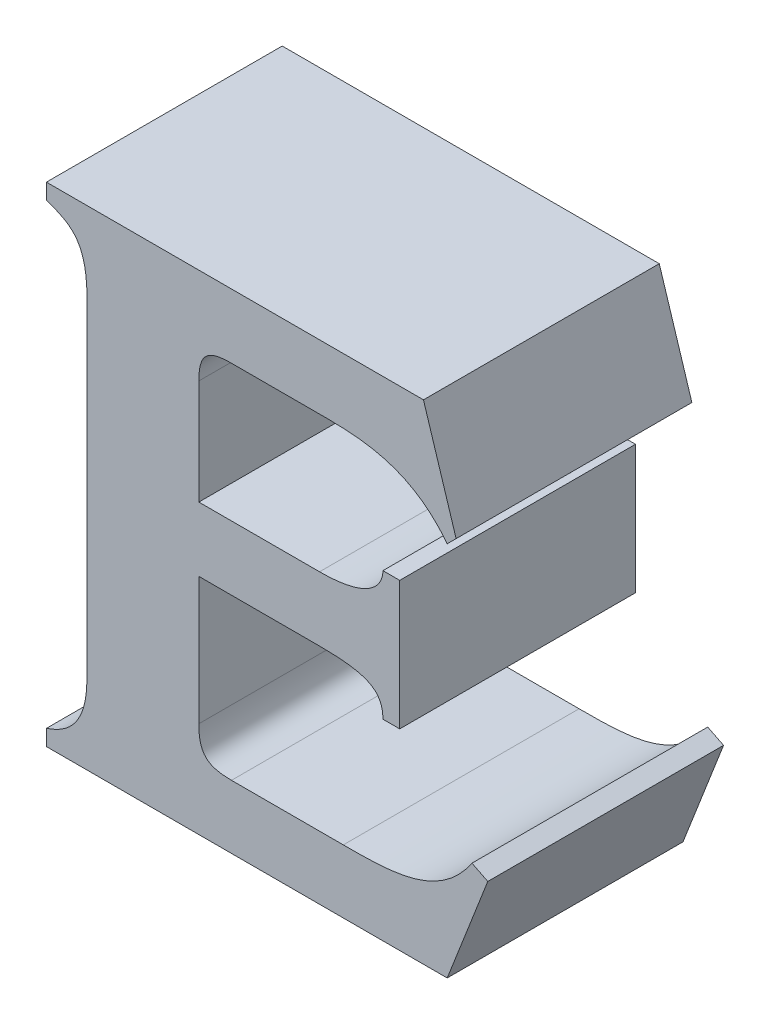
ISO-10303-21;
HEADER;
FILE_DESCRIPTION(('STEP AP214'),'2;1');
FILE_NAME('part.step','',(''),(''),'','','');
FILE_SCHEMA(('AUTOMOTIVE_DESIGN { 1 0 10303 214 1 1 1 1 }'));
ENDSEC;
DATA;
#1=APPLICATION_CONTEXT('core data for automotive mechanical design processes');
#2=APPLICATION_PROTOCOL_DEFINITION('international standard','automotive_design',2000,#1);
#3=PRODUCT_CONTEXT('',#1,'mechanical');
#4=PRODUCT('Part','Part','',(#3));
#5=PRODUCT_RELATED_PRODUCT_CATEGORY('part','',(#4));
#6=PRODUCT_DEFINITION_FORMATION('','',#4);
#7=PRODUCT_DEFINITION_CONTEXT('part definition',#1,'design');
#8=PRODUCT_DEFINITION('design','',#6,#7);
#9=PRODUCT_DEFINITION_SHAPE('','',#8);
#10=(LENGTH_UNIT() NAMED_UNIT(*) SI_UNIT(.MILLI.,.METRE.));
#11=(NAMED_UNIT(*) PLANE_ANGLE_UNIT() SI_UNIT($,.RADIAN.));
#12=(NAMED_UNIT(*) SI_UNIT($,.STERADIAN.) SOLID_ANGLE_UNIT());
#13=UNCERTAINTY_MEASURE_WITH_UNIT(LENGTH_MEASURE(1.E-05),#10,'distance_accuracy_value','');
#14=(GEOMETRIC_REPRESENTATION_CONTEXT(3) GLOBAL_UNCERTAINTY_ASSIGNED_CONTEXT((#13)) GLOBAL_UNIT_ASSIGNED_CONTEXT((#10,
#11,#12)) REPRESENTATION_CONTEXT('',''));
#15=CARTESIAN_POINT('',(0.,0.,0.));
#16=DIRECTION('',(0.,0.,1.));
#17=DIRECTION('',(1.,0.,0.));
#18=AXIS2_PLACEMENT_3D('',#15,#16,#17);
#19=CARTESIAN_POINT('',(2.257040111163,-0.25995003071244,0.));
#20=CARTESIAN_POINT('',(2.257040111163,-0.25995003071244,0.1));
#21=CARTESIAN_POINT('',(2.267113803681,-0.26330769945751,0.));
#22=CARTESIAN_POINT('',(2.267113803681,-0.26330769945751,0.1));
#23=CARTESIAN_POINT('',(2.274249270892,-0.26666549298124,0.));
#24=CARTESIAN_POINT('',(2.274249270892,-0.26666549298124,0.1));
#25=CARTESIAN_POINT('',(2.274249270892,-0.28723157278345,0.));
#26=CARTESIAN_POINT('',(2.274249270892,-0.28723157278345,0.1));
#27=B_SPLINE_SURFACE_WITH_KNOTS('',3,1,((#19,#20),(#21,#22),(#23,#24),(#25,#26)),.UNSPECIFIED.,
.F.,.F.,.F.,(4,4),(2,2),(-1.,0.),(0.,0.01),.UNSPECIFIED.);
#28=CARTESIAN_POINT('',(2.274249270892,-0.28723157278345,0.));
#29=CARTESIAN_POINT('',(2.274249270892,-0.26666549298124,0.));
#30=CARTESIAN_POINT('',(2.267113803681,-0.26330769945751,0.));
#31=CARTESIAN_POINT('',(2.257040111163,-0.25995003071244,0.));
#32=B_SPLINE_CURVE_WITH_KNOTS('',3,(#28,#29,#30,#31),.UNSPECIFIED.,.F.,.F.,(4,4),(0.,1.),.UNSPECIFIED.);
#33=CARTESIAN_POINT('',(2.274249270892,-0.28723157278345,0.));
#34=VERTEX_POINT('',#33);
#35=CARTESIAN_POINT('',(2.257040111163,-0.25995003071244,0.));
#36=VERTEX_POINT('',#35);
#37=EDGE_CURVE('E11',#34,#36,#32,.T.);
#38=DIRECTION('',(0.,0.,1.));
#39=VECTOR('',#38,1.);
#40=CARTESIAN_POINT('',(2.274249270892,-0.28723157278345,0.));
#41=LINE('',#40,#39);
#42=CARTESIAN_POINT('',(2.274249270892,-0.28723157278345,0.1));
#43=VERTEX_POINT('',#42);
#44=EDGE_CURVE('E28',#34,#43,#41,.T.);
#45=CARTESIAN_POINT('',(2.257040111163,-0.25995003071244,0.1));
#46=CARTESIAN_POINT('',(2.267113803681,-0.26330769945751,0.1));
#47=CARTESIAN_POINT('',(2.274249270892,-0.26666549298124,0.1));
#48=CARTESIAN_POINT('',(2.274249270892,-0.28723157278345,0.1));
#49=B_SPLINE_CURVE_WITH_KNOTS('',3,(#45,#46,#47,#48),.UNSPECIFIED.,.F.,.F.,(4,4),(-1.,0.),.UNSPECIFIED.);
#50=CARTESIAN_POINT('',(2.257040111163,-0.25995003071244,0.1));
#51=VERTEX_POINT('',#50);
#52=EDGE_CURVE('E212',#51,#43,#49,.T.);
#53=DIRECTION('',(0.,0.,1.));
#54=VECTOR('',#53,1.);
#55=CARTESIAN_POINT('',(2.257040111163,-0.25995003071244,0.));
#56=LINE('',#55,#54);
#57=EDGE_CURVE('E467',#36,#51,#56,.T.);
#58=ORIENTED_EDGE('',*,*,#37,.F.);
#59=ORIENTED_EDGE('',*,*,#44,.T.);
#60=ORIENTED_EDGE('',*,*,#52,.F.);
#61=ORIENTED_EDGE('',*,*,#57,.F.);
#62=EDGE_LOOP('',(#58,#59,#60,#61));
#63=FACE_BOUND('',#62,.T.);
#64=ADVANCED_FACE('F17',(#63),#27,.T.);
#65=CARTESIAN_POINT('',(2.257040111163,-0.25323453724898,0.));
#66=DIRECTION('',(-1.,0.,0.));
#67=DIRECTION('',(0.,-1.,0.));
#68=AXIS2_PLACEMENT_3D('',#65,#66,#67);
#69=PLANE('',#68);
#70=DIRECTION('',(0.,1.,0.));
#71=VECTOR('',#70,1.);
#72=CARTESIAN_POINT('',(2.257040111163,-0.25995003071244,0.));
#73=LINE('',#72,#71);
#74=CARTESIAN_POINT('',(2.257040111163,-0.25323453724898,0.));
#75=VERTEX_POINT('',#74);
#76=EDGE_CURVE('E465',#36,#75,#73,.T.);
#77=ORIENTED_EDGE('',*,*,#76,.F.);
#78=ORIENTED_EDGE('',*,*,#57,.T.);
#79=DIRECTION('',(0.,-1.,0.));
#80=VECTOR('',#79,1.);
#81=CARTESIAN_POINT('',(2.257040111163,-0.25995003071244,0.1));
#82=LINE('',#81,#80);
#83=CARTESIAN_POINT('',(2.257040111163,-0.25323453724898,0.1));
#84=VERTEX_POINT('',#83);
#85=EDGE_CURVE('E463',#84,#51,#82,.T.);
#86=ORIENTED_EDGE('',*,*,#85,.F.);
#87=DIRECTION('',(0.,0.,1.));
#88=VECTOR('',#87,1.);
#89=CARTESIAN_POINT('',(2.257040111163,-0.25323453724898,0.));
#90=LINE('',#89,#88);
#91=EDGE_CURVE('E460',#75,#84,#90,.T.);
#92=ORIENTED_EDGE('',*,*,#91,.F.);
#93=EDGE_LOOP('',(#77,#78,#86,#92));
#94=FACE_BOUND('',#93,.T.);
#95=ADVANCED_FACE('F566',(#94),#69,.T.);
#96=CARTESIAN_POINT('',(2.416952376184,-0.25323453724898,0.));
#97=DIRECTION('',(0.,1.,0.));
#98=DIRECTION('',(-1.,0.,0.));
#99=AXIS2_PLACEMENT_3D('',#96,#97,#98);
#100=PLANE('',#99);
#101=DIRECTION('',(1.,0.,0.));
#102=VECTOR('',#101,1.);
#103=CARTESIAN_POINT('',(2.257040111163,-0.25323453724898,0.));
#104=LINE('',#103,#102);
#105=CARTESIAN_POINT('',(2.416952376184,-0.25323453724898,0.));
#106=VERTEX_POINT('',#105);
#107=EDGE_CURVE('E458',#75,#106,#104,.T.);
#108=ORIENTED_EDGE('',*,*,#107,.F.);
#109=ORIENTED_EDGE('',*,*,#91,.T.);
#110=DIRECTION('',(-1.,0.,0.));
#111=VECTOR('',#110,1.);
#112=CARTESIAN_POINT('',(2.257040111163,-0.25323453724898,0.1));
#113=LINE('',#112,#111);
#114=CARTESIAN_POINT('',(2.416952376184,-0.25323453724898,0.1));
#115=VERTEX_POINT('',#114);
#116=EDGE_CURVE('E455',#115,#84,#113,.T.);
#117=ORIENTED_EDGE('',*,*,#116,.F.);
#118=DIRECTION('',(0.,0.,1.));
#119=VECTOR('',#118,1.);
#120=CARTESIAN_POINT('',(2.416952376184,-0.25323453724898,0.));
#121=LINE('',#120,#119);
#122=EDGE_CURVE('E452',#106,#115,#121,.T.);
#123=ORIENTED_EDGE('',*,*,#122,.F.);
#124=EDGE_LOOP('',(#108,#109,#117,#123));
#125=FACE_BOUND('',#124,.T.);
#126=ADVANCED_FACE('F562',(#125),#100,.T.);
#127=CARTESIAN_POINT('',(2.430803118496,-0.29730473499199,0.));
#128=DIRECTION('',(0.953993043631218,0.299828738954831,0.));
#129=DIRECTION('',(-0.299828738954831,0.953993043631218,0.));
#130=AXIS2_PLACEMENT_3D('',#127,#128,#129);
#131=PLANE('',#130);
#132=DIRECTION('',(0.299828738954831,-0.953993043631218,0.));
#133=VECTOR('',#132,1.);
#134=CARTESIAN_POINT('',(2.416952376184,-0.25323453724898,0.));
#135=LINE('',#134,#133);
#136=CARTESIAN_POINT('',(2.430803118496,-0.29730473499199,0.));
#137=VERTEX_POINT('',#136);
#138=EDGE_CURVE('E450',#106,#137,#135,.T.);
#139=ORIENTED_EDGE('',*,*,#138,.F.);
#140=ORIENTED_EDGE('',*,*,#122,.T.);
#141=DIRECTION('',(-0.299828738954831,0.953993043631218,0.));
#142=VECTOR('',#141,1.);
#143=CARTESIAN_POINT('',(2.416952376184,-0.25323453724898,0.1));
#144=LINE('',#143,#142);
#145=CARTESIAN_POINT('',(2.430803118496,-0.29730473499199,0.1));
#146=VERTEX_POINT('',#145);
#147=EDGE_CURVE('E447',#146,#115,#144,.T.);
#148=ORIENTED_EDGE('',*,*,#147,.F.);
#149=DIRECTION('',(0.,0.,1.));
#150=VECTOR('',#149,1.);
#151=CARTESIAN_POINT('',(2.430803118496,-0.29730473499199,0.));
#152=LINE('',#151,#150);
#153=EDGE_CURVE('E444',#137,#146,#152,.T.);
#154=ORIENTED_EDGE('',*,*,#153,.F.);
#155=EDGE_LOOP('',(#139,#140,#148,#154));
#156=FACE_BOUND('',#155,.T.);
#157=ADVANCED_FACE('F558',(#156),#131,.T.);
#158=CARTESIAN_POINT('',(2.427026068702,-0.301082252706,0.));
#159=DIRECTION('',(0.707150577097307,-0.707062982563043,0.));
#160=DIRECTION('',(0.707062982563043,0.707150577097307,0.));
#161=AXIS2_PLACEMENT_3D('',#158,#159,#160);
#162=PLANE('',#161);
#163=DIRECTION('',(-0.707062982563043,-0.707150577097307,0.));
#164=VECTOR('',#163,1.);
#165=CARTESIAN_POINT('',(2.430803118496,-0.29730473499199,0.));
#166=LINE('',#165,#164);
#167=CARTESIAN_POINT('',(2.427026068702,-0.301082252706,0.));
#168=VERTEX_POINT('',#167);
#169=EDGE_CURVE('E442',#137,#168,#166,.T.);
#170=ORIENTED_EDGE('',*,*,#169,.F.);
#171=ORIENTED_EDGE('',*,*,#153,.T.);
#172=DIRECTION('',(0.707062982563043,0.707150577097307,0.));
#173=VECTOR('',#172,1.);
#174=CARTESIAN_POINT('',(2.430803118496,-0.29730473499199,0.1));
#175=LINE('',#174,#173);
#176=CARTESIAN_POINT('',(2.427026068702,-0.301082252706,0.1));
#177=VERTEX_POINT('',#176);
#178=EDGE_CURVE('E439',#177,#146,#175,.T.);
#179=ORIENTED_EDGE('',*,*,#178,.F.);
#180=DIRECTION('',(0.,0.,1.));
#181=VECTOR('',#180,1.);
#182=CARTESIAN_POINT('',(2.427026068702,-0.301082252706,0.));
#183=LINE('',#182,#181);
#184=EDGE_CURVE('E433',#168,#177,#183,.T.);
#185=ORIENTED_EDGE('',*,*,#184,.F.);
#186=EDGE_LOOP('',(#170,#171,#179,#185));
#187=FACE_BOUND('',#186,.T.);
#188=ADVANCED_FACE('F554',(#187),#162,.T.);
#189=CARTESIAN_POINT('',(2.376240221522,-0.28051607931998,0.));
#190=CARTESIAN_POINT('',(2.376240221522,-0.28051607931998,0.1));
#191=CARTESIAN_POINT('',(2.396386046825,-0.28051607931998,0.));
#192=CARTESIAN_POINT('',(2.396386046825,-0.28051607931998,0.1));
#193=CARTESIAN_POINT('',(2.413595206554,-0.28387387284371,0.));
#194=CARTESIAN_POINT('',(2.413595206554,-0.28387387284371,0.1));
#195=CARTESIAN_POINT('',(2.427026068702,-0.301082252706,0.));
#196=CARTESIAN_POINT('',(2.427026068702,-0.301082252706,0.1));
#197=B_SPLINE_SURFACE_WITH_KNOTS('',3,1,((#189,#190),(#191,#192),(#193,#194),(#195,#196)),
.UNSPECIFIED.,.F.,.F.,.F.,(4,4),(2,2),(-1.,0.),(0.,0.01),.UNSPECIFIED.);
#198=CARTESIAN_POINT('',(2.427026068702,-0.301082252706,0.));
#199=CARTESIAN_POINT('',(2.413595206554,-0.28387387284371,0.));
#200=CARTESIAN_POINT('',(2.396386046825,-0.28051607931998,0.));
#201=CARTESIAN_POINT('',(2.376240221522,-0.28051607931998,0.));
#202=B_SPLINE_CURVE_WITH_KNOTS('',3,(#198,#199,#200,#201),.UNSPECIFIED.,.F.,.F.,(4,4),(0.,1.),.UNSPECIFIED.);
#203=CARTESIAN_POINT('',(2.376240221522,-0.28051607931998,0.));
#204=VERTEX_POINT('',#203);
#205=EDGE_CURVE('E426',#168,#204,#202,.T.);
#206=CARTESIAN_POINT('',(2.376240221522,-0.28051607931998,0.1));
#207=CARTESIAN_POINT('',(2.396386046825,-0.28051607931998,0.1));
#208=CARTESIAN_POINT('',(2.413595206554,-0.28387387284371,0.1));
#209=CARTESIAN_POINT('',(2.427026068702,-0.301082252706,0.1));
#210=B_SPLINE_CURVE_WITH_KNOTS('',3,(#206,#207,#208,#209),.UNSPECIFIED.,.F.,.F.,(4,4),(-1.,0.),.UNSPECIFIED.);
#211=CARTESIAN_POINT('',(2.376240221522,-0.28051607931998,0.1));
#212=VERTEX_POINT('',#211);
#213=EDGE_CURVE('E421',#212,#177,#210,.T.);
#214=DIRECTION('',(0.,0.,1.));
#215=VECTOR('',#214,1.);
#216=CARTESIAN_POINT('',(2.376240221522,-0.28051607931998,0.));
#217=LINE('',#216,#215);
#218=EDGE_CURVE('E418',#204,#212,#217,.T.);
#219=ORIENTED_EDGE('',*,*,#205,.F.);
#220=ORIENTED_EDGE('',*,*,#184,.T.);
#221=ORIENTED_EDGE('',*,*,#213,.F.);
#222=ORIENTED_EDGE('',*,*,#218,.F.);
#223=EDGE_LOOP('',(#219,#220,#221,#222));
#224=FACE_BOUND('',#223,.T.);
#225=ADVANCED_FACE('F550',(#224),#197,.T.);
#226=CARTESIAN_POINT('',(2.335527754914,-0.28051607931998,0.));
#227=DIRECTION('',(0.,-1.,0.));
#228=DIRECTION('',(1.,0.,0.));
#229=AXIS2_PLACEMENT_3D('',#226,#227,#228);
#230=PLANE('',#229);
#231=DIRECTION('',(-1.,0.,0.));
#232=VECTOR('',#231,1.);
#233=CARTESIAN_POINT('',(2.376240221522,-0.28051607931998,0.));
#234=LINE('',#233,#232);
#235=CARTESIAN_POINT('',(2.335527754914,-0.28051607931998,0.));
#236=VERTEX_POINT('',#235);
#237=EDGE_CURVE('E416',#204,#236,#234,.T.);
#238=ORIENTED_EDGE('',*,*,#237,.F.);
#239=ORIENTED_EDGE('',*,*,#218,.T.);
#240=DIRECTION('',(1.,0.,0.));
#241=VECTOR('',#240,1.);
#242=CARTESIAN_POINT('',(2.376240221522,-0.28051607931998,0.1));
#243=LINE('',#242,#241);
#244=CARTESIAN_POINT('',(2.335527754914,-0.28051607931998,0.1));
#245=VERTEX_POINT('',#244);
#246=EDGE_CURVE('E413',#245,#212,#243,.T.);
#247=ORIENTED_EDGE('',*,*,#246,.F.);
#248=DIRECTION('',(0.,0.,1.));
#249=VECTOR('',#248,1.);
#250=CARTESIAN_POINT('',(2.335527754914,-0.28051607931998,0.));
#251=LINE('',#250,#249);
#252=EDGE_CURVE('E407',#236,#245,#251,.T.);
#253=ORIENTED_EDGE('',*,*,#252,.F.);
#254=EDGE_LOOP('',(#238,#239,#247,#253));
#255=FACE_BOUND('',#254,.T.);
#256=ADVANCED_FACE('F546',(#255),#230,.T.);
#257=CARTESIAN_POINT('',(2.321677012602,-0.29394706624691,0.));
#258=CARTESIAN_POINT('',(2.321677012602,-0.29394706624691,0.1));
#259=CARTESIAN_POINT('',(2.321677012602,-0.283873872843711,0.));
#260=CARTESIAN_POINT('',(2.321677012602,-0.283873872843711,0.1));
#261=CARTESIAN_POINT('',(2.325035430019,-0.280516079319981,0.));
#262=CARTESIAN_POINT('',(2.325035430019,-0.280516079319981,0.1));
#263=CARTESIAN_POINT('',(2.335527754914,-0.28051607931998,0.));
#264=CARTESIAN_POINT('',(2.335527754914,-0.28051607931998,0.1));
#265=B_SPLINE_SURFACE_WITH_KNOTS('',3,1,((#257,#258),(#259,#260),(#261,#262),(#263,#264)),
.UNSPECIFIED.,.F.,.F.,.F.,(4,4),(2,2),(-1.,0.),(0.,0.01),.UNSPECIFIED.);
#266=CARTESIAN_POINT('',(2.335527754914,-0.28051607931998,0.));
#267=CARTESIAN_POINT('',(2.325035430019,-0.280516079319981,0.));
#268=CARTESIAN_POINT('',(2.321677012602,-0.283873872843711,0.));
#269=CARTESIAN_POINT('',(2.321677012602,-0.29394706624691,0.));
#270=B_SPLINE_CURVE_WITH_KNOTS('',3,(#266,#267,#268,#269),.UNSPECIFIED.,.F.,.F.,(4,4),(0.,1.),.UNSPECIFIED.);
#271=CARTESIAN_POINT('',(2.321677012602,-0.29394706624691,0.));
#272=VERTEX_POINT('',#271);
#273=EDGE_CURVE('E400',#236,#272,#270,.T.);
#274=CARTESIAN_POINT('',(2.321677012602,-0.29394706624691,0.1));
#275=CARTESIAN_POINT('',(2.321677012602,-0.283873872843711,0.1));
#276=CARTESIAN_POINT('',(2.325035430019,-0.280516079319981,0.1));
#277=CARTESIAN_POINT('',(2.335527754914,-0.28051607931998,0.1));
#278=B_SPLINE_CURVE_WITH_KNOTS('',3,(#274,#275,#276,#277),.UNSPECIFIED.,.F.,.F.,(4,4),(-1.,0.),.UNSPECIFIED.);
#279=CARTESIAN_POINT('',(2.321677012602,-0.29394706624691,0.1));
#280=VERTEX_POINT('',#279);
#281=EDGE_CURVE('E395',#280,#245,#278,.T.);
#282=DIRECTION('',(0.,0.,1.));
#283=VECTOR('',#282,1.);
#284=CARTESIAN_POINT('',(2.321677012602,-0.29394706624691,0.));
#285=LINE('',#284,#283);
#286=EDGE_CURVE('E392',#272,#280,#285,.T.);
#287=ORIENTED_EDGE('',*,*,#273,.F.);
#288=ORIENTED_EDGE('',*,*,#252,.T.);
#289=ORIENTED_EDGE('',*,*,#281,.F.);
#290=ORIENTED_EDGE('',*,*,#286,.F.);
#291=EDGE_LOOP('',(#287,#288,#289,#290));
#292=FACE_BOUND('',#291,.T.);
#293=ADVANCED_FACE('F542',(#292),#265,.T.);
#294=CARTESIAN_POINT('',(2.321677012602,-0.33843698818,0.));
#295=DIRECTION('',(1.,0.,0.));
#296=DIRECTION('',(0.,1.,0.));
#297=AXIS2_PLACEMENT_3D('',#294,#295,#296);
#298=PLANE('',#297);
#299=DIRECTION('',(0.,-1.,0.));
#300=VECTOR('',#299,1.);
#301=CARTESIAN_POINT('',(2.321677012602,-0.29394706624691,0.));
#302=LINE('',#301,#300);
#303=CARTESIAN_POINT('',(2.321677012602,-0.33843698818,0.));
#304=VERTEX_POINT('',#303);
#305=EDGE_CURVE('E390',#272,#304,#302,.T.);
#306=ORIENTED_EDGE('',*,*,#305,.F.);
#307=ORIENTED_EDGE('',*,*,#286,.T.);
#308=DIRECTION('',(0.,1.,0.));
#309=VECTOR('',#308,1.);
#310=CARTESIAN_POINT('',(2.321677012602,-0.29394706624691,0.1));
#311=LINE('',#310,#309);
#312=CARTESIAN_POINT('',(2.321677012602,-0.33843698818,0.1));
#313=VERTEX_POINT('',#312);
#314=EDGE_CURVE('E387',#313,#280,#311,.T.);
#315=ORIENTED_EDGE('',*,*,#314,.F.);
#316=DIRECTION('',(0.,0.,1.));
#317=VECTOR('',#316,1.);
#318=CARTESIAN_POINT('',(2.321677012602,-0.33843698818,0.));
#319=LINE('',#318,#317);
#320=EDGE_CURVE('E384',#304,#313,#319,.T.);
#321=ORIENTED_EDGE('',*,*,#320,.F.);
#322=EDGE_LOOP('',(#306,#307,#315,#321));
#323=FACE_BOUND('',#322,.T.);
#324=ADVANCED_FACE('F538',(#323),#298,.T.);
#325=CARTESIAN_POINT('',(2.372883051892,-0.33843698818,0.));
#326=DIRECTION('',(0.,1.,0.));
#327=DIRECTION('',(-1.,0.,0.));
#328=AXIS2_PLACEMENT_3D('',#325,#326,#327);
#329=PLANE('',#328);
#330=DIRECTION('',(1.,0.,0.));
#331=VECTOR('',#330,1.);
#332=CARTESIAN_POINT('',(2.321677012602,-0.33843698818,0.));
#333=LINE('',#332,#331);
#334=CARTESIAN_POINT('',(2.372883051892,-0.33843698818,0.));
#335=VERTEX_POINT('',#334);
#336=EDGE_CURVE('E382',#304,#335,#333,.T.);
#337=ORIENTED_EDGE('',*,*,#336,.F.);
#338=ORIENTED_EDGE('',*,*,#320,.T.);
#339=DIRECTION('',(-1.,0.,0.));
#340=VECTOR('',#339,1.);
#341=CARTESIAN_POINT('',(2.321677012602,-0.33843698818,0.1));
#342=LINE('',#341,#340);
#343=CARTESIAN_POINT('',(2.372883051892,-0.33843698818,0.1));
#344=VERTEX_POINT('',#343);
#345=EDGE_CURVE('E379',#344,#313,#342,.T.);
#346=ORIENTED_EDGE('',*,*,#345,.F.);
#347=DIRECTION('',(0.,0.,1.));
#348=VECTOR('',#347,1.);
#349=CARTESIAN_POINT('',(2.372883051892,-0.33843698818,0.));
#350=LINE('',#349,#348);
#351=EDGE_CURVE('E373',#335,#344,#350,.T.);
#352=ORIENTED_EDGE('',*,*,#351,.F.);
#353=EDGE_LOOP('',(#337,#338,#346,#352));
#354=FACE_BOUND('',#353,.T.);
#355=ADVANCED_FACE('F534',(#354),#329,.T.);
#356=CARTESIAN_POINT('',(2.399744464242,-0.324586401842,0.));
#357=CARTESIAN_POINT('',(2.399744464242,-0.324586401842,0.1));
#358=CARTESIAN_POINT('',(2.399744464242,-0.325739771816933,0.));
#359=CARTESIAN_POINT('',(2.399744464242,-0.325739771816933,0.1));
#360=CARTESIAN_POINT('',(2.399546374781,-0.326872743783356,0.));
#361=CARTESIAN_POINT('',(2.399546374781,-0.326872743783356,0.1));
#362=CARTESIAN_POINT('',(2.398714006222,-0.329144178592833,0.));
#363=CARTESIAN_POINT('',(2.398714006222,-0.329144178592833,0.1));
#364=CARTESIAN_POINT('',(2.398059521087,-0.330221366822531,0.));
#365=CARTESIAN_POINT('',(2.398059521087,-0.330221366822531,0.1));
#366=CARTESIAN_POINT('',(2.395942997548,-0.332703011870604,0.));
#367=CARTESIAN_POINT('',(2.395942997548,-0.332703011870604,0.1));
#368=CARTESIAN_POINT('',(2.394280510628,-0.333886760831212,0.));
#369=CARTESIAN_POINT('',(2.394280510628,-0.333886760831212,0.1));
#370=CARTESIAN_POINT('',(2.390032531593,-0.336084495495303,0.));
#371=CARTESIAN_POINT('',(2.390032531593,-0.336084495495303,0.1));
#372=CARTESIAN_POINT('',(2.387230743201,-0.336909730052862,0.));
#373=CARTESIAN_POINT('',(2.387230743201,-0.336909730052862,0.1));
#374=CARTESIAN_POINT('',(2.380734122965,-0.33817836475508,0.));
#375=CARTESIAN_POINT('',(2.380734122965,-0.33817836475508,0.1));
#376=CARTESIAN_POINT('',(2.376718552933,-0.33843698818,0.));
#377=CARTESIAN_POINT('',(2.376718552933,-0.33843698818,0.1));
#378=CARTESIAN_POINT('',(2.372883051892,-0.33843698818,0.));
#379=CARTESIAN_POINT('',(2.372883051892,-0.33843698818,0.1));
#380=B_SPLINE_SURFACE_WITH_KNOTS('',3,1,((#356,#357),(#358,#359),(#360,#361),(#362,#363),(#364,
#365),(#366,#367),(#368,#369),(#370,#371),(#372,#373),(#374,#375),(#376,#377),(#378,#379)),
.UNSPECIFIED.,.F.,.F.,.F.,(4,2,2,2,2,4),(2,2),(-0.003320004529042,-0.002971228597344,
-0.002589112087022,-0.001987326490876,-0.001150650312329,0.),(0.,0.01),.UNSPECIFIED.);
#381=CARTESIAN_POINT('',(2.372883051892,-0.33843698818,0.));
#382=CARTESIAN_POINT('',(2.376718552933,-0.33843698818,0.));
#383=CARTESIAN_POINT('',(2.380734122965,-0.33817836475508,0.));
#384=CARTESIAN_POINT('',(2.387230743201,-0.336909730052862,0.));
#385=CARTESIAN_POINT('',(2.390032531593,-0.336084495495303,0.));
#386=CARTESIAN_POINT('',(2.394280510628,-0.333886760831212,0.));
#387=CARTESIAN_POINT('',(2.395942997548,-0.332703011870604,0.));
#388=CARTESIAN_POINT('',(2.398059521087,-0.330221366822531,0.));
#389=CARTESIAN_POINT('',(2.398714006222,-0.329144178592833,0.));
#390=CARTESIAN_POINT('',(2.399546374781,-0.326872743783356,0.));
#391=CARTESIAN_POINT('',(2.399744464242,-0.325739771816933,0.));
#392=CARTESIAN_POINT('',(2.399744464242,-0.324586401842,0.));
#393=B_SPLINE_CURVE_WITH_KNOTS('',3,(#381,#382,#383,#384,#385,#386,#387,#388,#389,#390,#391,
#392),.UNSPECIFIED.,.F.,.F.,(4,2,2,2,2,4),(0.,0.001150650312329,0.001987326490876,
0.002589112087022,0.002971228597344,0.003320004529042),.UNSPECIFIED.);
#394=CARTESIAN_POINT('',(2.399744464242,-0.324586401842,0.));
#395=VERTEX_POINT('',#394);
#396=EDGE_CURVE('E366',#335,#395,#393,.T.);
#397=CARTESIAN_POINT('',(2.399744464242,-0.324586401842,0.1));
#398=CARTESIAN_POINT('',(2.399744464242,-0.325739771816933,0.1));
#399=CARTESIAN_POINT('',(2.399546374781,-0.326872743783356,0.1));
#400=CARTESIAN_POINT('',(2.398714006222,-0.329144178592833,0.1));
#401=CARTESIAN_POINT('',(2.398059521087,-0.330221366822531,0.1));
#402=CARTESIAN_POINT('',(2.395942997548,-0.332703011870604,0.1));
#403=CARTESIAN_POINT('',(2.394280510628,-0.333886760831212,0.1));
#404=CARTESIAN_POINT('',(2.390032531593,-0.336084495495303,0.1));
#405=CARTESIAN_POINT('',(2.387230743201,-0.336909730052862,0.1));
#406=CARTESIAN_POINT('',(2.380734122965,-0.33817836475508,0.1));
#407=CARTESIAN_POINT('',(2.376718552933,-0.33843698818,0.1));
#408=CARTESIAN_POINT('',(2.372883051892,-0.33843698818,0.1));
#409=B_SPLINE_CURVE_WITH_KNOTS('',3,(#397,#398,#399,#400,#401,#402,#403,#404,#405,#406,#407,
#408),.UNSPECIFIED.,.F.,.F.,(4,2,2,2,2,4),(-0.003320004529042,-0.002971228597344,
-0.002589112087022,-0.001987326490876,-0.001150650312329,0.),.UNSPECIFIED.);
#410=CARTESIAN_POINT('',(2.399744464242,-0.324586401842,0.1));
#411=VERTEX_POINT('',#410);
#412=EDGE_CURVE('E361',#411,#344,#409,.T.);
#413=DIRECTION('',(0.,0.,1.));
#414=VECTOR('',#413,1.);
#415=CARTESIAN_POINT('',(2.399744464242,-0.324586401842,0.));
#416=LINE('',#415,#414);
#417=EDGE_CURVE('E358',#395,#411,#416,.T.);
#418=ORIENTED_EDGE('',*,*,#396,.F.);
#419=ORIENTED_EDGE('',*,*,#351,.T.);
#420=ORIENTED_EDGE('',*,*,#412,.F.);
#421=ORIENTED_EDGE('',*,*,#417,.F.);
#422=EDGE_LOOP('',(#418,#419,#420,#421));
#423=FACE_BOUND('',#422,.T.);
#424=ADVANCED_FACE('F530',(#423),#380,.T.);
#425=CARTESIAN_POINT('',(2.406879931453,-0.324586401842,0.));
#426=DIRECTION('',(0.,1.,0.));
#427=DIRECTION('',(-1.,0.,0.));
#428=AXIS2_PLACEMENT_3D('',#425,#426,#427);
#429=PLANE('',#428);
#430=DIRECTION('',(1.,0.,0.));
#431=VECTOR('',#430,1.);
#432=CARTESIAN_POINT('',(2.399744464242,-0.324586401842,0.));
#433=LINE('',#432,#431);
#434=CARTESIAN_POINT('',(2.406879931453,-0.324586401842,0.));
#435=VERTEX_POINT('',#434);
#436=EDGE_CURVE('E356',#395,#435,#433,.T.);
#437=ORIENTED_EDGE('',*,*,#436,.F.);
#438=ORIENTED_EDGE('',*,*,#417,.T.);
#439=DIRECTION('',(-1.,0.,0.));
#440=VECTOR('',#439,1.);
#441=CARTESIAN_POINT('',(2.399744464242,-0.324586401842,0.1));
#442=LINE('',#441,#440);
#443=CARTESIAN_POINT('',(2.406879931453,-0.324586401842,0.1));
#444=VERTEX_POINT('',#443);
#445=EDGE_CURVE('E353',#444,#411,#442,.T.);
#446=ORIENTED_EDGE('',*,*,#445,.F.);
#447=DIRECTION('',(0.,0.,1.));
#448=VECTOR('',#447,1.);
#449=CARTESIAN_POINT('',(2.406879931453,-0.324586401842,0.));
#450=LINE('',#449,#448);
#451=EDGE_CURVE('E350',#435,#444,#450,.T.);
#452=ORIENTED_EDGE('',*,*,#451,.F.);
#453=EDGE_LOOP('',(#437,#438,#446,#452));
#454=FACE_BOUND('',#453,.T.);
#455=ADVANCED_FACE('F526',(#454),#429,.T.);
#456=CARTESIAN_POINT('',(2.406879931453,-0.379149485984,0.));
#457=DIRECTION('',(1.,0.,0.));
#458=DIRECTION('',(0.,1.,0.));
#459=AXIS2_PLACEMENT_3D('',#456,#457,#458);
#460=PLANE('',#459);
#461=DIRECTION('',(0.,-1.,0.));
#462=VECTOR('',#461,1.);
#463=CARTESIAN_POINT('',(2.406879931453,-0.324586401842,0.));
#464=LINE('',#463,#462);
#465=CARTESIAN_POINT('',(2.406879931453,-0.379149485984,0.));
#466=VERTEX_POINT('',#465);
#467=EDGE_CURVE('E348',#435,#466,#464,.T.);
#468=ORIENTED_EDGE('',*,*,#467,.F.);
#469=ORIENTED_EDGE('',*,*,#451,.T.);
#470=DIRECTION('',(0.,1.,0.));
#471=VECTOR('',#470,1.);
#472=CARTESIAN_POINT('',(2.406879931453,-0.324586401842,0.1));
#473=LINE('',#472,#471);
#474=CARTESIAN_POINT('',(2.406879931453,-0.379149485984,0.1));
#475=VERTEX_POINT('',#474);
#476=EDGE_CURVE('E345',#475,#444,#473,.T.);
#477=ORIENTED_EDGE('',*,*,#476,.F.);
#478=DIRECTION('',(0.,0.,1.));
#479=VECTOR('',#478,1.);
#480=CARTESIAN_POINT('',(2.406879931453,-0.379149485984,0.));
#481=LINE('',#480,#479);
#482=EDGE_CURVE('E342',#466,#475,#481,.T.);
#483=ORIENTED_EDGE('',*,*,#482,.F.);
#484=EDGE_LOOP('',(#468,#469,#477,#483));
#485=FACE_BOUND('',#484,.T.);
#486=ADVANCED_FACE('F522',(#485),#460,.T.);
#487=CARTESIAN_POINT('',(2.399744464242,-0.379149485984,0.));
#488=DIRECTION('',(0.,-1.,0.));
#489=DIRECTION('',(1.,0.,0.));
#490=AXIS2_PLACEMENT_3D('',#487,#488,#489);
#491=PLANE('',#490);
#492=DIRECTION('',(-1.,0.,0.));
#493=VECTOR('',#492,1.);
#494=CARTESIAN_POINT('',(2.406879931453,-0.379149485984,0.));
#495=LINE('',#494,#493);
#496=CARTESIAN_POINT('',(2.399744464242,-0.379149485984,0.));
#497=VERTEX_POINT('',#496);
#498=EDGE_CURVE('E340',#466,#497,#495,.T.);
#499=ORIENTED_EDGE('',*,*,#498,.F.);
#500=ORIENTED_EDGE('',*,*,#482,.T.);
#501=DIRECTION('',(1.,0.,0.));
#502=VECTOR('',#501,1.);
#503=CARTESIAN_POINT('',(2.406879931453,-0.379149485984,0.1));
#504=LINE('',#503,#502);
#505=CARTESIAN_POINT('',(2.399744464242,-0.379149485984,0.1));
#506=VERTEX_POINT('',#505);
#507=EDGE_CURVE('E337',#506,#475,#504,.T.);
#508=ORIENTED_EDGE('',*,*,#507,.F.);
#509=DIRECTION('',(0.,0.,1.));
#510=VECTOR('',#509,1.);
#511=CARTESIAN_POINT('',(2.399744464242,-0.379149485984,0.));
#512=LINE('',#511,#510);
#513=EDGE_CURVE('E331',#497,#506,#512,.T.);
#514=ORIENTED_EDGE('',*,*,#513,.F.);
#515=EDGE_LOOP('',(#499,#500,#508,#514));
#516=FACE_BOUND('',#515,.T.);
#517=ADVANCED_FACE('F518',(#516),#491,.T.);
#518=CARTESIAN_POINT('',(2.372883051892,-0.365718530251,0.));
#519=CARTESIAN_POINT('',(2.372883051892,-0.365718530251,0.1));
#520=CARTESIAN_POINT('',(2.393029189141,-0.365718530250999,0.));
#521=CARTESIAN_POINT('',(2.393029189141,-0.365718530250999,0.1));
#522=CARTESIAN_POINT('',(2.399744464242,-0.369076323774999,0.));
#523=CARTESIAN_POINT('',(2.399744464242,-0.369076323774999,0.1));
#524=CARTESIAN_POINT('',(2.399744464242,-0.379149485984,0.));
#525=CARTESIAN_POINT('',(2.399744464242,-0.379149485984,0.1));
#526=B_SPLINE_SURFACE_WITH_KNOTS('',3,1,((#518,#519),(#520,#521),(#522,#523),(#524,#525)),
.UNSPECIFIED.,.F.,.F.,.F.,(4,4),(2,2),(-1.,0.),(0.,0.01),.UNSPECIFIED.);
#527=CARTESIAN_POINT('',(2.399744464242,-0.379149485984,0.));
#528=CARTESIAN_POINT('',(2.399744464242,-0.369076323774999,0.));
#529=CARTESIAN_POINT('',(2.393029189141,-0.365718530250999,0.));
#530=CARTESIAN_POINT('',(2.372883051892,-0.365718530251,0.));
#531=B_SPLINE_CURVE_WITH_KNOTS('',3,(#527,#528,#529,#530),.UNSPECIFIED.,.F.,.F.,(4,4),(0.,1.),.UNSPECIFIED.);
#532=CARTESIAN_POINT('',(2.372883051892,-0.365718530251,0.));
#533=VERTEX_POINT('',#532);
#534=EDGE_CURVE('E324',#497,#533,#531,.T.);
#535=CARTESIAN_POINT('',(2.372883051892,-0.365718530251,0.1));
#536=CARTESIAN_POINT('',(2.393029189141,-0.365718530250999,0.1));
#537=CARTESIAN_POINT('',(2.399744464242,-0.369076323774999,0.1));
#538=CARTESIAN_POINT('',(2.399744464242,-0.379149485984,0.1));
#539=B_SPLINE_CURVE_WITH_KNOTS('',3,(#535,#536,#537,#538),.UNSPECIFIED.,.F.,.F.,(4,4),(-1.,0.),.UNSPECIFIED.);
#540=CARTESIAN_POINT('',(2.372883051892,-0.365718530251,0.1));
#541=VERTEX_POINT('',#540);
#542=EDGE_CURVE('E319',#541,#506,#539,.T.);
#543=DIRECTION('',(0.,0.,1.));
#544=VECTOR('',#543,1.);
#545=CARTESIAN_POINT('',(2.372883051892,-0.365718530251,0.));
#546=LINE('',#545,#544);
#547=EDGE_CURVE('E316',#533,#541,#546,.T.);
#548=ORIENTED_EDGE('',*,*,#534,.F.);
#549=ORIENTED_EDGE('',*,*,#513,.T.);
#550=ORIENTED_EDGE('',*,*,#542,.F.);
#551=ORIENTED_EDGE('',*,*,#547,.F.);
#552=EDGE_LOOP('',(#548,#549,#550,#551));
#553=FACE_BOUND('',#552,.T.);
#554=ADVANCED_FACE('F514',(#553),#526,.T.);
#555=CARTESIAN_POINT('',(2.321677012602,-0.365718530251,0.));
#556=DIRECTION('',(0.,-1.,0.));
#557=DIRECTION('',(1.,0.,0.));
#558=AXIS2_PLACEMENT_3D('',#555,#556,#557);
#559=PLANE('',#558);
#560=DIRECTION('',(-1.,0.,0.));
#561=VECTOR('',#560,1.);
#562=CARTESIAN_POINT('',(2.372883051892,-0.365718530251,0.));
#563=LINE('',#562,#561);
#564=CARTESIAN_POINT('',(2.321677012602,-0.365718530251,0.));
#565=VERTEX_POINT('',#564);
#566=EDGE_CURVE('E314',#533,#565,#563,.T.);
#567=ORIENTED_EDGE('',*,*,#566,.F.);
#568=ORIENTED_EDGE('',*,*,#547,.T.);
#569=DIRECTION('',(1.,0.,0.));
#570=VECTOR('',#569,1.);
#571=CARTESIAN_POINT('',(2.372883051892,-0.365718530251,0.1));
#572=LINE('',#571,#570);
#573=CARTESIAN_POINT('',(2.321677012602,-0.365718530251,0.1));
#574=VERTEX_POINT('',#573);
#575=EDGE_CURVE('E311',#574,#541,#572,.T.);
#576=ORIENTED_EDGE('',*,*,#575,.F.);
#577=DIRECTION('',(0.,0.,1.));
#578=VECTOR('',#577,1.);
#579=CARTESIAN_POINT('',(2.321677012602,-0.365718530251,0.));
#580=LINE('',#579,#578);
#581=EDGE_CURVE('E308',#565,#574,#580,.T.);
#582=ORIENTED_EDGE('',*,*,#581,.F.);
#583=EDGE_LOOP('',(#567,#568,#576,#582));
#584=FACE_BOUND('',#583,.T.);
#585=ADVANCED_FACE('F510',(#584),#559,.T.);
#586=CARTESIAN_POINT('',(2.321677012602,-0.419862014982,0.));
#587=DIRECTION('',(1.,0.,0.));
#588=DIRECTION('',(0.,1.,0.));
#589=AXIS2_PLACEMENT_3D('',#586,#587,#588);
#590=PLANE('',#589);
#591=DIRECTION('',(0.,-1.,0.));
#592=VECTOR('',#591,1.);
#593=CARTESIAN_POINT('',(2.321677012602,-0.365718530251,0.));
#594=LINE('',#593,#592);
#595=CARTESIAN_POINT('',(2.321677012602,-0.419862014982,0.));
#596=VERTEX_POINT('',#595);
#597=EDGE_CURVE('E306',#565,#596,#594,.T.);
#598=ORIENTED_EDGE('',*,*,#597,.F.);
#599=ORIENTED_EDGE('',*,*,#581,.T.);
#600=DIRECTION('',(0.,1.,0.));
#601=VECTOR('',#600,1.);
#602=CARTESIAN_POINT('',(2.321677012602,-0.365718530251,0.1));
#603=LINE('',#602,#601);
#604=CARTESIAN_POINT('',(2.321677012602,-0.419862014982,0.1));
#605=VERTEX_POINT('',#604);
#606=EDGE_CURVE('E303',#605,#574,#603,.T.);
#607=ORIENTED_EDGE('',*,*,#606,.F.);
#608=DIRECTION('',(0.,0.,1.));
#609=VECTOR('',#608,1.);
#610=CARTESIAN_POINT('',(2.321677012602,-0.419862014982,0.));
#611=LINE('',#610,#609);
#612=EDGE_CURVE('E297',#596,#605,#611,.T.);
#613=ORIENTED_EDGE('',*,*,#612,.F.);
#614=EDGE_LOOP('',(#598,#599,#607,#613));
#615=FACE_BOUND('',#614,.T.);
#616=ADVANCED_FACE('F506',(#615),#590,.T.);
#617=CARTESIAN_POINT('',(2.335527754914,-0.43371260132,0.));
#618=CARTESIAN_POINT('',(2.335527754914,-0.43371260132,0.1));
#619=CARTESIAN_POINT('',(2.325035430019,-0.43371260132,0.));
#620=CARTESIAN_POINT('',(2.325035430019,-0.43371260132,0.1));
#621=CARTESIAN_POINT('',(2.321677012602,-0.430354901381,0.));
#622=CARTESIAN_POINT('',(2.321677012602,-0.430354901381,0.1));
#623=CARTESIAN_POINT('',(2.321677012602,-0.419862014982,0.));
#624=CARTESIAN_POINT('',(2.321677012602,-0.419862014982,0.1));
#625=B_SPLINE_SURFACE_WITH_KNOTS('',3,1,((#617,#618),(#619,#620),(#621,#622),(#623,#624)),
.UNSPECIFIED.,.F.,.F.,.F.,(4,4),(2,2),(-1.,0.),(0.,0.01),.UNSPECIFIED.);
#626=CARTESIAN_POINT('',(2.321677012602,-0.419862014982,0.));
#627=CARTESIAN_POINT('',(2.321677012602,-0.430354901381,0.));
#628=CARTESIAN_POINT('',(2.325035430019,-0.43371260132,0.));
#629=CARTESIAN_POINT('',(2.335527754914,-0.43371260132,0.));
#630=B_SPLINE_CURVE_WITH_KNOTS('',3,(#626,#627,#628,#629),.UNSPECIFIED.,.F.,.F.,(4,4),(0.,1.),.UNSPECIFIED.);
#631=CARTESIAN_POINT('',(2.335527754914,-0.43371260132,0.));
#632=VERTEX_POINT('',#631);
#633=EDGE_CURVE('E290',#596,#632,#630,.T.);
#634=CARTESIAN_POINT('',(2.335527754914,-0.43371260132,0.1));
#635=CARTESIAN_POINT('',(2.325035430019,-0.43371260132,0.1));
#636=CARTESIAN_POINT('',(2.321677012602,-0.430354901381,0.1));
#637=CARTESIAN_POINT('',(2.321677012602,-0.419862014982,0.1));
#638=B_SPLINE_CURVE_WITH_KNOTS('',3,(#634,#635,#636,#637),.UNSPECIFIED.,.F.,.F.,(4,4),(-1.,0.),.UNSPECIFIED.);
#639=CARTESIAN_POINT('',(2.335527754914,-0.43371260132,0.1));
#640=VERTEX_POINT('',#639);
#641=EDGE_CURVE('E285',#640,#605,#638,.T.);
#642=DIRECTION('',(0.,0.,1.));
#643=VECTOR('',#642,1.);
#644=CARTESIAN_POINT('',(2.335527754914,-0.43371260132,0.));
#645=LINE('',#644,#643);
#646=EDGE_CURVE('E282',#632,#640,#645,.T.);
#647=ORIENTED_EDGE('',*,*,#633,.F.);
#648=ORIENTED_EDGE('',*,*,#612,.T.);
#649=ORIENTED_EDGE('',*,*,#641,.F.);
#650=ORIENTED_EDGE('',*,*,#646,.F.);
#651=EDGE_LOOP('',(#647,#648,#649,#650));
#652=FACE_BOUND('',#651,.T.);
#653=ADVANCED_FACE('F502',(#652),#625,.T.);
#654=CARTESIAN_POINT('',(2.382955496623,-0.43371260132,0.));
#655=DIRECTION('',(0.,1.,0.));
#656=DIRECTION('',(-1.,0.,0.));
#657=AXIS2_PLACEMENT_3D('',#654,#655,#656);
#658=PLANE('',#657);
#659=DIRECTION('',(1.,0.,0.));
#660=VECTOR('',#659,1.);
#661=CARTESIAN_POINT('',(2.335527754914,-0.43371260132,0.));
#662=LINE('',#661,#660);
#663=CARTESIAN_POINT('',(2.382955496623,-0.43371260132,0.));
#664=VERTEX_POINT('',#663);
#665=EDGE_CURVE('E280',#632,#664,#662,.T.);
#666=ORIENTED_EDGE('',*,*,#665,.F.);
#667=ORIENTED_EDGE('',*,*,#646,.T.);
#668=DIRECTION('',(-1.,0.,0.));
#669=VECTOR('',#668,1.);
#670=CARTESIAN_POINT('',(2.335527754914,-0.43371260132,0.1));
#671=LINE('',#670,#669);
#672=CARTESIAN_POINT('',(2.382955496623,-0.43371260132,0.1));
#673=VERTEX_POINT('',#672);
#674=EDGE_CURVE('E277',#673,#640,#671,.T.);
#675=ORIENTED_EDGE('',*,*,#674,.F.);
#676=DIRECTION('',(0.,0.,1.));
#677=VECTOR('',#676,1.);
#678=CARTESIAN_POINT('',(2.382955496623,-0.43371260132,0.));
#679=LINE('',#678,#677);
#680=EDGE_CURVE('E271',#664,#673,#679,.T.);
#681=ORIENTED_EDGE('',*,*,#680,.F.);
#682=EDGE_LOOP('',(#666,#667,#675,#681));
#683=FACE_BOUND('',#682,.T.);
#684=ADVANCED_FACE('F498',(#683),#658,.T.);
#685=CARTESIAN_POINT('',(2.437518393597,-0.413146521518,0.));
#686=CARTESIAN_POINT('',(2.437518393597,-0.413146521518,0.1));
#687=CARTESIAN_POINT('',(2.423667651285,-0.43371260132,0.));
#688=CARTESIAN_POINT('',(2.423667651285,-0.43371260132,0.1));
#689=CARTESIAN_POINT('',(2.403521514036,-0.43371260132,0.));
#690=CARTESIAN_POINT('',(2.403521514036,-0.43371260132,0.1));
#691=CARTESIAN_POINT('',(2.382955496623,-0.43371260132,0.));
#692=CARTESIAN_POINT('',(2.382955496623,-0.43371260132,0.1));
#693=B_SPLINE_SURFACE_WITH_KNOTS('',3,1,((#685,#686),(#687,#688),(#689,#690),(#691,#692)),
.UNSPECIFIED.,.F.,.F.,.F.,(4,4),(2,2),(-1.,0.),(0.,0.01),.UNSPECIFIED.);
#694=CARTESIAN_POINT('',(2.382955496623,-0.43371260132,0.));
#695=CARTESIAN_POINT('',(2.403521514036,-0.43371260132,0.));
#696=CARTESIAN_POINT('',(2.423667651285,-0.43371260132,0.));
#697=CARTESIAN_POINT('',(2.437518393597,-0.413146521518,0.));
#698=B_SPLINE_CURVE_WITH_KNOTS('',3,(#694,#695,#696,#697),.UNSPECIFIED.,.F.,.F.,(4,4),(0.,1.),.UNSPECIFIED.);
#699=CARTESIAN_POINT('',(2.437518393597,-0.413146521518,0.));
#700=VERTEX_POINT('',#699);
#701=EDGE_CURVE('E264',#664,#700,#698,.T.);
#702=CARTESIAN_POINT('',(2.437518393597,-0.413146521518,0.1));
#703=CARTESIAN_POINT('',(2.423667651285,-0.43371260132,0.1));
#704=CARTESIAN_POINT('',(2.403521514036,-0.43371260132,0.1));
#705=CARTESIAN_POINT('',(2.382955496623,-0.43371260132,0.1));
#706=B_SPLINE_CURVE_WITH_KNOTS('',3,(#702,#703,#704,#705),.UNSPECIFIED.,.F.,.F.,(4,4),(-1.,0.),.UNSPECIFIED.);
#707=CARTESIAN_POINT('',(2.437518393597,-0.413146521518,0.1));
#708=VERTEX_POINT('',#707);
#709=EDGE_CURVE('E259',#708,#673,#706,.T.);
#710=DIRECTION('',(0.,0.,1.));
#711=VECTOR('',#710,1.);
#712=CARTESIAN_POINT('',(2.437518393597,-0.413146521518,0.));
#713=LINE('',#712,#711);
#714=EDGE_CURVE('E256',#700,#708,#713,.T.);
#715=ORIENTED_EDGE('',*,*,#701,.F.);
#716=ORIENTED_EDGE('',*,*,#680,.T.);
#717=ORIENTED_EDGE('',*,*,#709,.F.);
#718=ORIENTED_EDGE('',*,*,#714,.F.);
#719=EDGE_LOOP('',(#715,#716,#717,#718));
#720=FACE_BOUND('',#719,.T.);
#721=ADVANCED_FACE('F494',(#720),#693,.T.);
#722=CARTESIAN_POINT('',(2.444233980645,-0.416504221458,0.));
#723=DIRECTION('',(0.4472036240978,0.894432176631517,0.));
#724=DIRECTION('',(-0.894432176631517,0.4472036240978,0.));
#725=AXIS2_PLACEMENT_3D('',#722,#723,#724);
#726=PLANE('',#725);
#727=DIRECTION('',(0.894432176631517,-0.4472036240978,0.));
#728=VECTOR('',#727,1.);
#729=CARTESIAN_POINT('',(2.437518393597,-0.413146521518,0.));
#730=LINE('',#729,#728);
#731=CARTESIAN_POINT('',(2.444233980645,-0.416504221458,0.));
#732=VERTEX_POINT('',#731);
#733=EDGE_CURVE('E254',#700,#732,#730,.T.);
#734=ORIENTED_EDGE('',*,*,#733,.F.);
#735=ORIENTED_EDGE('',*,*,#714,.T.);
#736=DIRECTION('',(-0.894432176631517,0.4472036240978,0.));
#737=VECTOR('',#736,1.);
#738=CARTESIAN_POINT('',(2.437518393597,-0.413146521518,0.1));
#739=LINE('',#738,#737);
#740=CARTESIAN_POINT('',(2.444233980645,-0.416504221458,0.1));
#741=VERTEX_POINT('',#740);
#742=EDGE_CURVE('E251',#741,#708,#739,.T.);
#743=ORIENTED_EDGE('',*,*,#742,.F.);
#744=DIRECTION('',(0.,0.,1.));
#745=VECTOR('',#744,1.);
#746=CARTESIAN_POINT('',(2.444233980645,-0.416504221458,0.));
#747=LINE('',#746,#745);
#748=EDGE_CURVE('E248',#732,#741,#747,.T.);
#749=ORIENTED_EDGE('',*,*,#748,.F.);
#750=EDGE_LOOP('',(#734,#735,#743,#749));
#751=FACE_BOUND('',#750,.T.);
#752=ADVANCED_FACE('F490',(#751),#726,.T.);
#753=CARTESIAN_POINT('',(2.427026068702,-0.46057454398,0.));
#754=DIRECTION('',(0.931507899101224,-0.363721093575867,0.));
#755=DIRECTION('',(0.363721093575867,0.931507899101224,0.));
#756=AXIS2_PLACEMENT_3D('',#753,#754,#755);
#757=PLANE('',#756);
#758=DIRECTION('',(-0.363721093575867,-0.931507899101224,0.));
#759=VECTOR('',#758,1.);
#760=CARTESIAN_POINT('',(2.444233980645,-0.416504221458,0.));
#761=LINE('',#760,#759);
#762=CARTESIAN_POINT('',(2.427026068702,-0.46057454398,0.));
#763=VERTEX_POINT('',#762);
#764=EDGE_CURVE('E246',#732,#763,#761,.T.);
#765=ORIENTED_EDGE('',*,*,#764,.F.);
#766=ORIENTED_EDGE('',*,*,#748,.T.);
#767=DIRECTION('',(0.363721093575867,0.931507899101224,0.));
#768=VECTOR('',#767,1.);
#769=CARTESIAN_POINT('',(2.444233980645,-0.416504221458,0.1));
#770=LINE('',#769,#768);
#771=CARTESIAN_POINT('',(2.427026068702,-0.46057454398,0.1));
#772=VERTEX_POINT('',#771);
#773=EDGE_CURVE('E243',#772,#741,#770,.T.);
#774=ORIENTED_EDGE('',*,*,#773,.F.);
#775=DIRECTION('',(0.,0.,1.));
#776=VECTOR('',#775,1.);
#777=CARTESIAN_POINT('',(2.427026068702,-0.46057454398,0.));
#778=LINE('',#777,#776);
#779=EDGE_CURVE('E240',#763,#772,#778,.T.);
#780=ORIENTED_EDGE('',*,*,#779,.F.);
#781=EDGE_LOOP('',(#765,#766,#774,#780));
#782=FACE_BOUND('',#781,.T.);
#783=ADVANCED_FACE('F486',(#782),#757,.T.);
#784=CARTESIAN_POINT('',(2.257040111163,-0.46057454398,0.));
#785=DIRECTION('',(0.,-1.,0.));
#786=DIRECTION('',(1.,0.,0.));
#787=AXIS2_PLACEMENT_3D('',#784,#785,#786);
#788=PLANE('',#787);
#789=DIRECTION('',(-1.,0.,0.));
#790=VECTOR('',#789,1.);
#791=CARTESIAN_POINT('',(2.427026068702,-0.46057454398,0.));
#792=LINE('',#791,#790);
#793=CARTESIAN_POINT('',(2.257040111163,-0.46057454398,0.));
#794=VERTEX_POINT('',#793);
#795=EDGE_CURVE('E238',#763,#794,#792,.T.);
#796=ORIENTED_EDGE('',*,*,#795,.F.);
#797=ORIENTED_EDGE('',*,*,#779,.T.);
#798=DIRECTION('',(1.,0.,0.));
#799=VECTOR('',#798,1.);
#800=CARTESIAN_POINT('',(2.427026068702,-0.46057454398,0.1));
#801=LINE('',#800,#799);
#802=CARTESIAN_POINT('',(2.257040111163,-0.46057454398,0.1));
#803=VERTEX_POINT('',#802);
#804=EDGE_CURVE('E235',#803,#772,#801,.T.);
#805=ORIENTED_EDGE('',*,*,#804,.F.);
#806=DIRECTION('',(0.,0.,1.));
#807=VECTOR('',#806,1.);
#808=CARTESIAN_POINT('',(2.257040111163,-0.46057454398,0.));
#809=LINE('',#808,#807);
#810=EDGE_CURVE('E232',#794,#803,#809,.T.);
#811=ORIENTED_EDGE('',*,*,#810,.F.);
#812=EDGE_LOOP('',(#796,#797,#805,#811));
#813=FACE_BOUND('',#812,.T.);
#814=ADVANCED_FACE('F482',(#813),#788,.T.);
#815=CARTESIAN_POINT('',(2.257040111163,-0.453859050516,0.));
#816=DIRECTION('',(-1.,0.,0.));
#817=DIRECTION('',(0.,-1.,0.));
#818=AXIS2_PLACEMENT_3D('',#815,#816,#817);
#819=PLANE('',#818);
#820=DIRECTION('',(0.,1.,0.));
#821=VECTOR('',#820,1.);
#822=CARTESIAN_POINT('',(2.257040111163,-0.46057454398,0.));
#823=LINE('',#822,#821);
#824=CARTESIAN_POINT('',(2.257040111163,-0.453859050516,0.));
#825=VERTEX_POINT('',#824);
#826=EDGE_CURVE('E230',#794,#825,#823,.T.);
#827=ORIENTED_EDGE('',*,*,#826,.F.);
#828=ORIENTED_EDGE('',*,*,#810,.T.);
#829=DIRECTION('',(0.,-1.,0.));
#830=VECTOR('',#829,1.);
#831=CARTESIAN_POINT('',(2.257040111163,-0.46057454398,0.1));
#832=LINE('',#831,#830);
#833=CARTESIAN_POINT('',(2.257040111163,-0.453859050516,0.1));
#834=VERTEX_POINT('',#833);
#835=EDGE_CURVE('E228',#834,#803,#832,.T.);
#836=ORIENTED_EDGE('',*,*,#835,.F.);
#837=DIRECTION('',(0.,0.,1.));
#838=VECTOR('',#837,1.);
#839=CARTESIAN_POINT('',(2.257040111163,-0.453859050516,0.));
#840=LINE('',#839,#838);
#841=EDGE_CURVE('E197',#825,#834,#840,.T.);
#842=ORIENTED_EDGE('',*,*,#841,.F.);
#843=EDGE_LOOP('',(#827,#828,#836,#842));
#844=FACE_BOUND('',#843,.T.);
#845=ADVANCED_FACE('F480',(#844),#819,.T.);
#846=CARTESIAN_POINT('',(2.274249270892,-0.426577508445,0.));
#847=CARTESIAN_POINT('',(2.274249270892,-0.426577508445,0.1));
#848=CARTESIAN_POINT('',(2.274249270892,-0.443785888308,0.));
#849=CARTESIAN_POINT('',(2.274249270892,-0.443785888308,0.1));
#850=CARTESIAN_POINT('',(2.267113803681,-0.450501256992,0.));
#851=CARTESIAN_POINT('',(2.267113803681,-0.450501256992,0.1));
#852=CARTESIAN_POINT('',(2.257040111163,-0.453859050516,0.));
#853=CARTESIAN_POINT('',(2.257040111163,-0.453859050516,0.1));
#854=B_SPLINE_SURFACE_WITH_KNOTS('',3,1,((#846,#847),(#848,#849),(#850,#851),(#852,#853)),
.UNSPECIFIED.,.F.,.F.,.F.,(4,4),(2,2),(-1.,0.),(0.,0.01),.UNSPECIFIED.);
#855=CARTESIAN_POINT('',(2.257040111163,-0.453859050516,0.));
#856=CARTESIAN_POINT('',(2.267113803681,-0.450501256992,0.));
#857=CARTESIAN_POINT('',(2.274249270892,-0.443785888308,0.));
#858=CARTESIAN_POINT('',(2.274249270892,-0.426577508445,0.));
#859=B_SPLINE_CURVE_WITH_KNOTS('',3,(#855,#856,#857,#858),.UNSPECIFIED.,.F.,.F.,(4,4),(0.,1.),.UNSPECIFIED.);
#860=CARTESIAN_POINT('',(2.274249270892,-0.426577508445,0.));
#861=VERTEX_POINT('',#860);
#862=EDGE_CURVE('E201',#825,#861,#859,.T.);
#863=CARTESIAN_POINT('',(2.274249270892,-0.426577508445,0.1));
#864=CARTESIAN_POINT('',(2.274249270892,-0.443785888308,0.1));
#865=CARTESIAN_POINT('',(2.267113803681,-0.450501256992,0.1));
#866=CARTESIAN_POINT('',(2.257040111163,-0.453859050516,0.1));
#867=B_SPLINE_CURVE_WITH_KNOTS('',3,(#863,#864,#865,#866),.UNSPECIFIED.,.F.,.F.,(4,4),(-1.,0.),.UNSPECIFIED.);
#868=CARTESIAN_POINT('',(2.274249270892,-0.426577508445,0.1));
#869=VERTEX_POINT('',#868);
#870=EDGE_CURVE('E190',#869,#834,#867,.T.);
#871=DIRECTION('',(0.,0.,1.));
#872=VECTOR('',#871,1.);
#873=CARTESIAN_POINT('',(2.274249270892,-0.426577508445,0.));
#874=LINE('',#873,#872);
#875=EDGE_CURVE('E194',#861,#869,#874,.T.);
#876=ORIENTED_EDGE('',*,*,#862,.F.);
#877=ORIENTED_EDGE('',*,*,#841,.T.);
#878=ORIENTED_EDGE('',*,*,#870,.F.);
#879=ORIENTED_EDGE('',*,*,#875,.F.);
#880=EDGE_LOOP('',(#876,#877,#878,#879));
#881=FACE_BOUND('',#880,.T.);
#882=ADVANCED_FACE('F193',(#881),#854,.T.);
#883=CARTESIAN_POINT('',(2.274249270892,-0.28723157278345,0.));
#884=DIRECTION('',(-1.,0.,0.));
#885=DIRECTION('',(0.,-1.,0.));
#886=AXIS2_PLACEMENT_3D('',#883,#884,#885);
#887=PLANE('',#886);
#888=DIRECTION('',(0.,1.,0.));
#889=VECTOR('',#888,1.);
#890=CARTESIAN_POINT('',(2.274249270892,-0.426577508445,0.));
#891=LINE('',#890,#889);
#892=EDGE_CURVE('E207',#861,#34,#891,.T.);
#893=ORIENTED_EDGE('',*,*,#892,.F.);
#894=ORIENTED_EDGE('',*,*,#875,.T.);
#895=DIRECTION('',(0.,-1.,0.));
#896=VECTOR('',#895,1.);
#897=CARTESIAN_POINT('',(2.274249270892,-0.426577508445,0.1));
#898=LINE('',#897,#896);
#899=EDGE_CURVE('E206',#43,#869,#898,.T.);
#900=ORIENTED_EDGE('',*,*,#899,.F.);
#901=ORIENTED_EDGE('',*,*,#44,.F.);
#902=EDGE_LOOP('',(#893,#894,#900,#901));
#903=FACE_BOUND('',#902,.T.);
#904=ADVANCED_FACE('F205',(#903),#887,.T.);
#905=CARTESIAN_POINT('',(2.347280567099,-0.357838143507618,0.));
#906=DIRECTION('',(0.,0.,1.));
#907=DIRECTION('',(1.,0.,0.));
#908=AXIS2_PLACEMENT_3D('',#905,#906,#907);
#909=PLANE('',#908);
#910=ORIENTED_EDGE('',*,*,#892,.T.);
#911=ORIENTED_EDGE('',*,*,#37,.T.);
#912=ORIENTED_EDGE('',*,*,#76,.T.);
#913=ORIENTED_EDGE('',*,*,#107,.T.);
#914=ORIENTED_EDGE('',*,*,#138,.T.);
#915=ORIENTED_EDGE('',*,*,#169,.T.);
#916=ORIENTED_EDGE('',*,*,#205,.T.);
#917=ORIENTED_EDGE('',*,*,#237,.T.);
#918=ORIENTED_EDGE('',*,*,#273,.T.);
#919=ORIENTED_EDGE('',*,*,#305,.T.);
#920=ORIENTED_EDGE('',*,*,#336,.T.);
#921=ORIENTED_EDGE('',*,*,#396,.T.);
#922=ORIENTED_EDGE('',*,*,#436,.T.);
#923=ORIENTED_EDGE('',*,*,#467,.T.);
#924=ORIENTED_EDGE('',*,*,#498,.T.);
#925=ORIENTED_EDGE('',*,*,#534,.T.);
#926=ORIENTED_EDGE('',*,*,#566,.T.);
#927=ORIENTED_EDGE('',*,*,#597,.T.);
#928=ORIENTED_EDGE('',*,*,#633,.T.);
#929=ORIENTED_EDGE('',*,*,#665,.T.);
#930=ORIENTED_EDGE('',*,*,#701,.T.);
#931=ORIENTED_EDGE('',*,*,#733,.T.);
#932=ORIENTED_EDGE('',*,*,#764,.T.);
#933=ORIENTED_EDGE('',*,*,#795,.T.);
#934=ORIENTED_EDGE('',*,*,#826,.T.);
#935=ORIENTED_EDGE('',*,*,#862,.T.);
#936=EDGE_LOOP('',(#910,#911,#912,#913,#914,#915,#916,#917,#918,#919,#920,#921,#922,#923,#924,
#925,#926,#927,#928,#929,#930,#931,#932,#933,#934,#935));
#937=FACE_BOUND('',#936,.T.);
#938=ADVANCED_FACE('F475',(#937),#909,.F.);
#939=CARTESIAN_POINT('',(2.347280567099,-0.357838143507618,0.1));
#940=DIRECTION('',(0.,0.,1.));
#941=DIRECTION('',(1.,0.,0.));
#942=AXIS2_PLACEMENT_3D('',#939,#940,#941);
#943=PLANE('',#942);
#944=ORIENTED_EDGE('',*,*,#899,.T.);
#945=ORIENTED_EDGE('',*,*,#870,.T.);
#946=ORIENTED_EDGE('',*,*,#835,.T.);
#947=ORIENTED_EDGE('',*,*,#804,.T.);
#948=ORIENTED_EDGE('',*,*,#773,.T.);
#949=ORIENTED_EDGE('',*,*,#742,.T.);
#950=ORIENTED_EDGE('',*,*,#709,.T.);
#951=ORIENTED_EDGE('',*,*,#674,.T.);
#952=ORIENTED_EDGE('',*,*,#641,.T.);
#953=ORIENTED_EDGE('',*,*,#606,.T.);
#954=ORIENTED_EDGE('',*,*,#575,.T.);
#955=ORIENTED_EDGE('',*,*,#542,.T.);
#956=ORIENTED_EDGE('',*,*,#507,.T.);
#957=ORIENTED_EDGE('',*,*,#476,.T.);
#958=ORIENTED_EDGE('',*,*,#445,.T.);
#959=ORIENTED_EDGE('',*,*,#412,.T.);
#960=ORIENTED_EDGE('',*,*,#345,.T.);
#961=ORIENTED_EDGE('',*,*,#314,.T.);
#962=ORIENTED_EDGE('',*,*,#281,.T.);
#963=ORIENTED_EDGE('',*,*,#246,.T.);
#964=ORIENTED_EDGE('',*,*,#213,.T.);
#965=ORIENTED_EDGE('',*,*,#178,.T.);
#966=ORIENTED_EDGE('',*,*,#147,.T.);
#967=ORIENTED_EDGE('',*,*,#116,.T.);
#968=ORIENTED_EDGE('',*,*,#85,.T.);
#969=ORIENTED_EDGE('',*,*,#52,.T.);
#970=EDGE_LOOP('',(#944,#945,#946,#947,#948,#949,#950,#951,#952,#953,#954,#955,#956,#957,#958,
#959,#960,#961,#962,#963,#964,#965,#966,#967,#968,#969));
#971=FACE_BOUND('',#970,.T.);
#972=ADVANCED_FACE('F210',(#971),#943,.T.);
#973=CLOSED_SHELL('',(#64,#95,#126,#157,#188,#225,#256,#293,#324,#355,#424,#455,#486,#517,#554,
#585,#616,#653,#684,#721,#752,#783,#814,#845,#882,#904,#938,#972));
#974=MANIFOLD_SOLID_BREP('B1',#973);
#975=ADVANCED_BREP_SHAPE_REPRESENTATION('',(#18,#974),#14);
#976=SHAPE_DEFINITION_REPRESENTATION(#9,#975);
ENDSEC;
END-ISO-10303-21;
